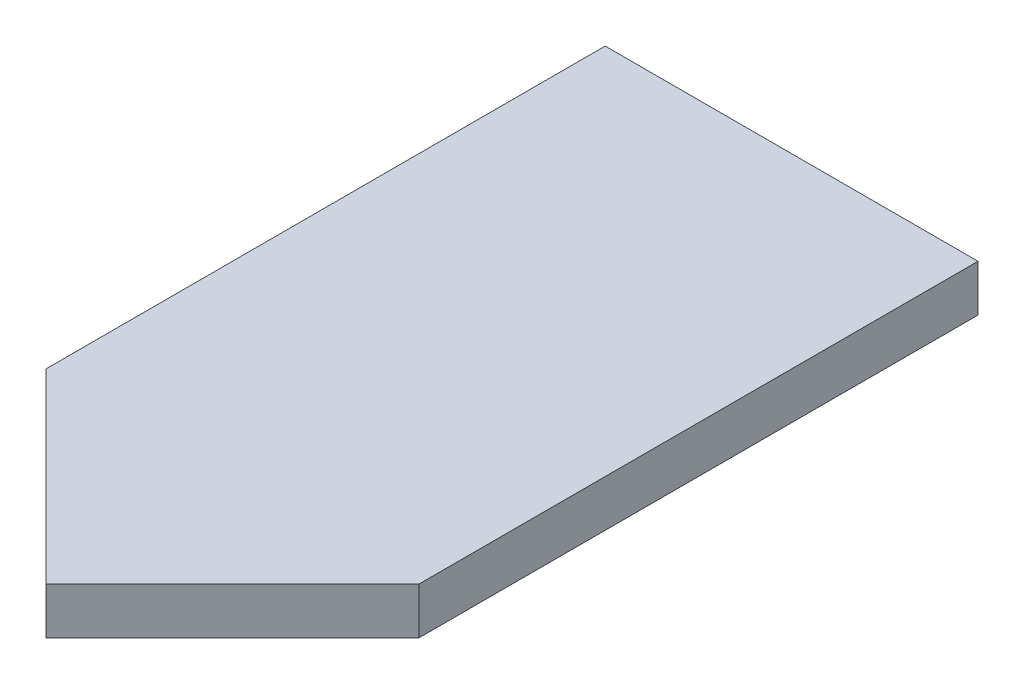
ISO-10303-21;
HEADER;
FILE_DESCRIPTION(('STEP AP214'),'2;1');
FILE_NAME('part.step','',(''),(''),'','','');
FILE_SCHEMA(('AUTOMOTIVE_DESIGN { 1 0 10303 214 1 1 1 1 }'));
ENDSEC;
DATA;
#1=APPLICATION_CONTEXT('core data for automotive mechanical design processes');
#2=APPLICATION_PROTOCOL_DEFINITION('international standard','automotive_design',2000,#1);
#3=PRODUCT_CONTEXT('',#1,'mechanical');
#4=PRODUCT('Part','Part','',(#3));
#5=PRODUCT_RELATED_PRODUCT_CATEGORY('part','',(#4));
#6=PRODUCT_DEFINITION_FORMATION('','',#4);
#7=PRODUCT_DEFINITION_CONTEXT('part definition',#1,'design');
#8=PRODUCT_DEFINITION('design','',#6,#7);
#9=PRODUCT_DEFINITION_SHAPE('','',#8);
#10=(LENGTH_UNIT() NAMED_UNIT(*) SI_UNIT(.MILLI.,.METRE.));
#11=(NAMED_UNIT(*) PLANE_ANGLE_UNIT() SI_UNIT($,.RADIAN.));
#12=(NAMED_UNIT(*) SI_UNIT($,.STERADIAN.) SOLID_ANGLE_UNIT());
#13=UNCERTAINTY_MEASURE_WITH_UNIT(LENGTH_MEASURE(1.E-05),#10,'distance_accuracy_value','');
#14=(GEOMETRIC_REPRESENTATION_CONTEXT(3) GLOBAL_UNCERTAINTY_ASSIGNED_CONTEXT((#13)) GLOBAL_UNIT_ASSIGNED_CONTEXT((#10,
#11,#12)) REPRESENTATION_CONTEXT('',''));
#15=CARTESIAN_POINT('',(0.,0.,0.));
#16=DIRECTION('',(0.,0.,1.));
#17=DIRECTION('',(1.,0.,0.));
#18=AXIS2_PLACEMENT_3D('',#15,#16,#17);
#19=CARTESIAN_POINT('',(6.35,1.5875,0.));
#20=DIRECTION('',(-1.,0.,0.));
#21=DIRECTION('',(0.,0.,1.));
#22=AXIS2_PLACEMENT_3D('',#19,#20,#21);
#23=PLANE('',#22);
#24=DIRECTION('',(0.,0.,-1.));
#25=VECTOR('',#24,1.);
#26=CARTESIAN_POINT('',(6.35,0.,0.));
#27=LINE('',#26,#25);
#28=CARTESIAN_POINT('',(6.35,0.,19.05));
#29=VERTEX_POINT('',#28);
#30=CARTESIAN_POINT('',(6.35,0.,0.));
#31=VERTEX_POINT('',#30);
#32=EDGE_CURVE('E110',#29,#31,#27,.T.);
#33=ORIENTED_EDGE('',*,*,#32,.T.);
#34=DIRECTION('',(0.,-1.,0.));
#35=VECTOR('',#34,1.);
#36=CARTESIAN_POINT('',(6.35,1.5875,0.));
#37=LINE('',#36,#35);
#38=CARTESIAN_POINT('',(6.35,1.5875,0.));
#39=VERTEX_POINT('',#38);
#40=EDGE_CURVE('E11',#39,#31,#37,.T.);
#41=ORIENTED_EDGE('',*,*,#40,.F.);
#42=DIRECTION('',(0.,0.,-1.));
#43=VECTOR('',#42,1.);
#44=CARTESIAN_POINT('',(6.35,1.5875,0.));
#45=LINE('',#44,#43);
#46=CARTESIAN_POINT('',(6.35,1.5875,19.05));
#47=VERTEX_POINT('',#46);
#48=EDGE_CURVE('E118',#47,#39,#45,.T.);
#49=ORIENTED_EDGE('',*,*,#48,.F.);
#50=DIRECTION('',(0.,-1.,0.));
#51=VECTOR('',#50,1.);
#52=CARTESIAN_POINT('',(6.35,1.5875,19.05));
#53=LINE('',#52,#51);
#54=EDGE_CURVE('E106',#47,#29,#53,.T.);
#55=ORIENTED_EDGE('',*,*,#54,.T.);
#56=EDGE_LOOP('',(#33,#41,#49,#55));
#57=FACE_BOUND('',#56,.T.);
#58=ADVANCED_FACE('F36',(#57),#23,.F.);
#59=CARTESIAN_POINT('',(-6.35,1.5875,0.));
#60=DIRECTION('',(0.,0.,1.));
#61=DIRECTION('',(1.,0.,0.));
#62=AXIS2_PLACEMENT_3D('',#59,#60,#61);
#63=PLANE('',#62);
#64=DIRECTION('',(-1.,0.,0.));
#65=VECTOR('',#64,1.);
#66=CARTESIAN_POINT('',(-6.35,0.,0.));
#67=LINE('',#66,#65);
#68=CARTESIAN_POINT('',(-6.35,0.,0.));
#69=VERTEX_POINT('',#68);
#70=EDGE_CURVE('E113',#31,#69,#67,.T.);
#71=ORIENTED_EDGE('',*,*,#70,.T.);
#72=DIRECTION('',(0.,-1.,0.));
#73=VECTOR('',#72,1.);
#74=CARTESIAN_POINT('',(-6.35,1.5875,0.));
#75=LINE('',#74,#73);
#76=CARTESIAN_POINT('',(-6.35,1.5875,0.));
#77=VERTEX_POINT('',#76);
#78=EDGE_CURVE('E44',#77,#69,#75,.T.);
#79=ORIENTED_EDGE('',*,*,#78,.F.);
#80=DIRECTION('',(-1.,0.,0.));
#81=VECTOR('',#80,1.);
#82=CARTESIAN_POINT('',(-6.35,1.5875,0.));
#83=LINE('',#82,#81);
#84=EDGE_CURVE('E86',#39,#77,#83,.T.);
#85=ORIENTED_EDGE('',*,*,#84,.F.);
#86=ORIENTED_EDGE('',*,*,#40,.T.);
#87=EDGE_LOOP('',(#71,#79,#85,#86));
#88=FACE_BOUND('',#87,.T.);
#89=ADVANCED_FACE('F137',(#88),#63,.F.);
#90=CARTESIAN_POINT('',(-6.35,1.5875,0.));
#91=DIRECTION('',(1.,0.,0.));
#92=DIRECTION('',(0.,0.,-1.));
#93=AXIS2_PLACEMENT_3D('',#90,#91,#92);
#94=PLANE('',#93);
#95=DIRECTION('',(0.,0.,1.));
#96=VECTOR('',#95,1.);
#97=CARTESIAN_POINT('',(-6.35,0.,0.));
#98=LINE('',#97,#96);
#99=CARTESIAN_POINT('',(-6.35,0.,19.05));
#100=VERTEX_POINT('',#99);
#101=EDGE_CURVE('E101',#69,#100,#98,.T.);
#102=ORIENTED_EDGE('',*,*,#101,.T.);
#103=DIRECTION('',(0.,-1.,0.));
#104=VECTOR('',#103,1.);
#105=CARTESIAN_POINT('',(-6.35,1.5875,19.05));
#106=LINE('',#105,#104);
#107=CARTESIAN_POINT('',(-6.35,1.5875,19.05));
#108=VERTEX_POINT('',#107);
#109=EDGE_CURVE('E98',#108,#100,#106,.T.);
#110=ORIENTED_EDGE('',*,*,#109,.F.);
#111=DIRECTION('',(0.,0.,1.));
#112=VECTOR('',#111,1.);
#113=CARTESIAN_POINT('',(-6.35,1.5875,0.));
#114=LINE('',#113,#112);
#115=EDGE_CURVE('E90',#77,#108,#114,.T.);
#116=ORIENTED_EDGE('',*,*,#115,.F.);
#117=ORIENTED_EDGE('',*,*,#78,.T.);
#118=EDGE_LOOP('',(#102,#110,#116,#117));
#119=FACE_BOUND('',#118,.T.);
#120=ADVANCED_FACE('F99',(#119),#94,.F.);
#121=CARTESIAN_POINT('',(-6.35,1.5875,19.05));
#122=DIRECTION('',(0.707106781186547,0.,-0.707106781186548));
#123=DIRECTION('',(-0.707106781186548,0.,-0.707106781186547));
#124=AXIS2_PLACEMENT_3D('',#121,#122,#123);
#125=PLANE('',#124);
#126=DIRECTION('',(0.707106781186548,0.,0.707106781186547));
#127=VECTOR('',#126,1.);
#128=CARTESIAN_POINT('',(-6.35,0.,19.05));
#129=LINE('',#128,#127);
#130=CARTESIAN_POINT('',(0.,0.,25.4));
#131=VERTEX_POINT('',#130);
#132=EDGE_CURVE('E72',#100,#131,#129,.T.);
#133=ORIENTED_EDGE('',*,*,#132,.T.);
#134=DIRECTION('',(0.,-1.,0.));
#135=VECTOR('',#134,1.);
#136=CARTESIAN_POINT('',(0.,1.5875,25.4));
#137=LINE('',#136,#135);
#138=CARTESIAN_POINT('',(0.,1.5875,25.4));
#139=VERTEX_POINT('',#138);
#140=EDGE_CURVE('E102',#139,#131,#137,.T.);
#141=ORIENTED_EDGE('',*,*,#140,.F.);
#142=DIRECTION('',(0.707106781186548,0.,0.707106781186547));
#143=VECTOR('',#142,1.);
#144=CARTESIAN_POINT('',(-6.35,1.5875,19.05));
#145=LINE('',#144,#143);
#146=EDGE_CURVE('E94',#108,#139,#145,.T.);
#147=ORIENTED_EDGE('',*,*,#146,.F.);
#148=ORIENTED_EDGE('',*,*,#109,.T.);
#149=EDGE_LOOP('',(#133,#141,#147,#148));
#150=FACE_BOUND('',#149,.T.);
#151=ADVANCED_FACE('F104',(#150),#125,.F.);
#152=CARTESIAN_POINT('',(6.35,1.5875,19.05));
#153=DIRECTION('',(-0.707106781186547,0.,-0.707106781186548));
#154=DIRECTION('',(-0.707106781186548,0.,0.707106781186547));
#155=AXIS2_PLACEMENT_3D('',#152,#153,#154);
#156=PLANE('',#155);
#157=DIRECTION('',(0.707106781186548,0.,-0.707106781186547));
#158=VECTOR('',#157,1.);
#159=CARTESIAN_POINT('',(6.35,0.,19.05));
#160=LINE('',#159,#158);
#161=EDGE_CURVE('E78',#131,#29,#160,.T.);
#162=ORIENTED_EDGE('',*,*,#161,.T.);
#163=ORIENTED_EDGE('',*,*,#54,.F.);
#164=DIRECTION('',(0.707106781186548,0.,-0.707106781186547));
#165=VECTOR('',#164,1.);
#166=CARTESIAN_POINT('',(6.35,1.5875,19.05));
#167=LINE('',#166,#165);
#168=EDGE_CURVE('E52',#139,#47,#167,.T.);
#169=ORIENTED_EDGE('',*,*,#168,.F.);
#170=ORIENTED_EDGE('',*,*,#140,.T.);
#171=EDGE_LOOP('',(#162,#163,#169,#170));
#172=FACE_BOUND('',#171,.T.);
#173=ADVANCED_FACE('F126',(#172),#156,.F.);
#174=CARTESIAN_POINT('',(0.,1.5875,0.));
#175=DIRECTION('',(0.,1.,0.));
#176=DIRECTION('',(0.,0.,1.));
#177=AXIS2_PLACEMENT_3D('',#174,#175,#176);
#178=PLANE('',#177);
#179=ORIENTED_EDGE('',*,*,#48,.T.);
#180=ORIENTED_EDGE('',*,*,#84,.T.);
#181=ORIENTED_EDGE('',*,*,#115,.T.);
#182=ORIENTED_EDGE('',*,*,#146,.T.);
#183=ORIENTED_EDGE('',*,*,#168,.T.);
#184=EDGE_LOOP('',(#179,#180,#181,#182,#183));
#185=FACE_BOUND('',#184,.T.);
#186=ADVANCED_FACE('F92',(#185),#178,.T.);
#187=CARTESIAN_POINT('',(0.,0.,0.));
#188=DIRECTION('',(0.,1.,0.));
#189=DIRECTION('',(0.,0.,1.));
#190=AXIS2_PLACEMENT_3D('',#187,#188,#189);
#191=PLANE('',#190);
#192=ORIENTED_EDGE('',*,*,#32,.F.);
#193=ORIENTED_EDGE('',*,*,#161,.F.);
#194=ORIENTED_EDGE('',*,*,#132,.F.);
#195=ORIENTED_EDGE('',*,*,#101,.F.);
#196=ORIENTED_EDGE('',*,*,#70,.F.);
#197=EDGE_LOOP('',(#192,#193,#194,#195,#196));
#198=FACE_BOUND('',#197,.T.);
#199=ADVANCED_FACE('F122',(#198),#191,.F.);
#200=CLOSED_SHELL('',(#58,#89,#120,#151,#173,#186,#199));
#201=MANIFOLD_SOLID_BREP('B2',#200);
#202=ADVANCED_BREP_SHAPE_REPRESENTATION('',(#18,#201),#14);
#203=SHAPE_DEFINITION_REPRESENTATION(#9,#202);
ENDSEC;
END-ISO-10303-21;
